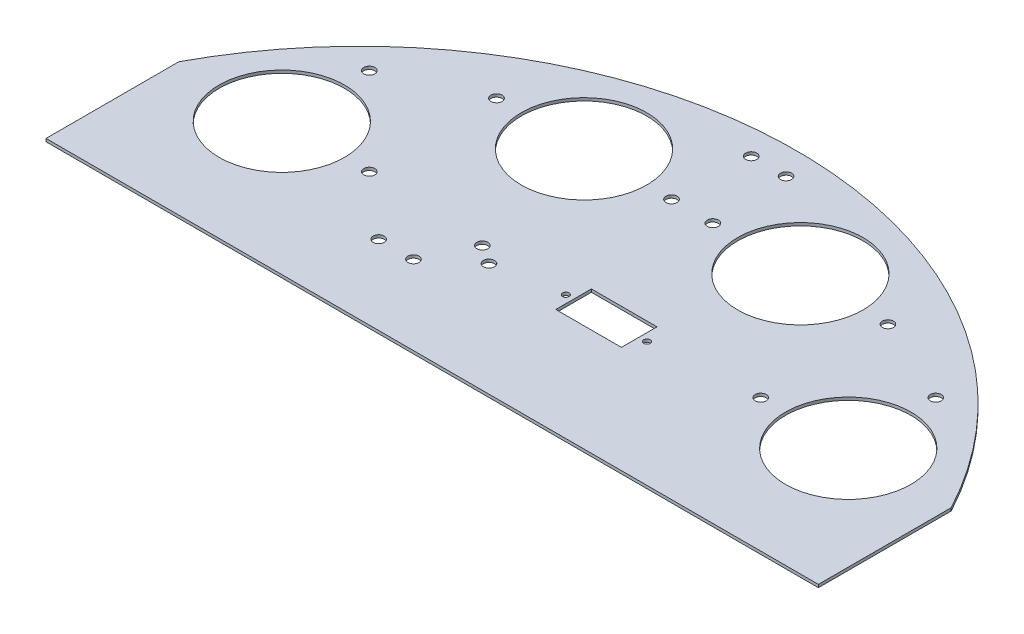
ISO-10303-21;
HEADER;
FILE_DESCRIPTION(('STEP AP214'),'2;1');
FILE_NAME('part.step','',(''),(''),'','','');
FILE_SCHEMA(('AUTOMOTIVE_DESIGN { 1 0 10303 214 1 1 1 1 }'));
ENDSEC;
DATA;
#1=APPLICATION_CONTEXT('core data for automotive mechanical design processes');
#2=APPLICATION_PROTOCOL_DEFINITION('international standard','automotive_design',2000,#1);
#3=PRODUCT_CONTEXT('',#1,'mechanical');
#4=PRODUCT('Part','Part','',(#3));
#5=PRODUCT_RELATED_PRODUCT_CATEGORY('part','',(#4));
#6=PRODUCT_DEFINITION_FORMATION('','',#4);
#7=PRODUCT_DEFINITION_CONTEXT('part definition',#1,'design');
#8=PRODUCT_DEFINITION('design','',#6,#7);
#9=PRODUCT_DEFINITION_SHAPE('','',#8);
#10=(LENGTH_UNIT() NAMED_UNIT(*) SI_UNIT(.MILLI.,.METRE.));
#11=(NAMED_UNIT(*) PLANE_ANGLE_UNIT() SI_UNIT($,.RADIAN.));
#12=(NAMED_UNIT(*) SI_UNIT($,.STERADIAN.) SOLID_ANGLE_UNIT());
#13=UNCERTAINTY_MEASURE_WITH_UNIT(LENGTH_MEASURE(1.E-05),#10,'distance_accuracy_value','');
#14=(GEOMETRIC_REPRESENTATION_CONTEXT(3) GLOBAL_UNCERTAINTY_ASSIGNED_CONTEXT((#13)) GLOBAL_UNIT_ASSIGNED_CONTEXT((#10,
#11,#12)) REPRESENTATION_CONTEXT('',''));
#15=CARTESIAN_POINT('',(0.,0.,0.));
#16=DIRECTION('',(0.,0.,1.));
#17=DIRECTION('',(1.,0.,0.));
#18=AXIS2_PLACEMENT_3D('',#15,#16,#17);
#19=CARTESIAN_POINT('',(0.,0.,0.));
#20=DIRECTION('',(0.,1.,0.));
#21=DIRECTION('',(0.,0.,1.));
#22=AXIS2_PLACEMENT_3D('',#19,#20,#21);
#23=PLANE('',#22);
#24=CARTESIAN_POINT('',(67.237534512333,0.,-26.561617597691));
#25=DIRECTION('',(0.,-1.,0.));
#26=DIRECTION('',(0.,0.,-1.));
#27=AXIS2_PLACEMENT_3D('',#24,#25,#26);
#28=CIRCLE('',#27,1.89865);
#29=CARTESIAN_POINT('',(67.237534512333,0.,-28.460267597691));
#30=VERTEX_POINT('',#29);
#31=EDGE_CURVE('E471',#30,#30,#28,.T.);
#32=ORIENTED_EDGE('',*,*,#31,.F.);
#33=EDGE_LOOP('',(#32));
#34=FACE_BOUND('',#33,.T.);
#35=CARTESIAN_POINT('',(67.2375345123306,0.,-70.1541692780059));
#36=DIRECTION('',(0.,-1.,0.));
#37=DIRECTION('',(0.,0.,-1.));
#38=AXIS2_PLACEMENT_3D('',#35,#36,#37);
#39=CIRCLE('',#38,1.89865);
#40=CARTESIAN_POINT('',(67.2375345123306,0.,-72.0528192780059));
#41=VERTEX_POINT('',#40);
#42=EDGE_CURVE('E479',#41,#41,#39,.T.);
#43=ORIENTED_EDGE('',*,*,#42,.F.);
#44=EDGE_LOOP('',(#43));
#45=FACE_BOUND('',#44,.T.);
#46=CARTESIAN_POINT('',(7.23753451233063,0.,-70.1541692780059));
#47=DIRECTION('',(0.,-1.,0.));
#48=DIRECTION('',(0.,0.,-1.));
#49=AXIS2_PLACEMENT_3D('',#46,#47,#48);
#50=CIRCLE('',#49,1.89865);
#51=CARTESIAN_POINT('',(7.23753451233063,0.,-72.0528192780059));
#52=VERTEX_POINT('',#51);
#53=EDGE_CURVE('E485',#52,#52,#50,.T.);
#54=ORIENTED_EDGE('',*,*,#53,.F.);
#55=EDGE_LOOP('',(#54));
#56=FACE_BOUND('',#55,.T.);
#57=CARTESIAN_POINT('',(-6.92654413765696,0.,-70.1541692780059));
#58=DIRECTION('',(0.,-1.,0.));
#59=DIRECTION('',(0.,0.,-1.));
#60=AXIS2_PLACEMENT_3D('',#57,#58,#59);
#61=CIRCLE('',#60,1.89865);
#62=CARTESIAN_POINT('',(-6.92654413765696,0.,-72.0528192780059));
#63=VERTEX_POINT('',#62);
#64=EDGE_CURVE('E491',#63,#63,#61,.T.);
#65=ORIENTED_EDGE('',*,*,#64,.F.);
#66=EDGE_LOOP('',(#65));
#67=FACE_BOUND('',#66,.T.);
#68=CARTESIAN_POINT('',(-66.926544137657,0.,-70.1541692780059));
#69=DIRECTION('',(0.,-1.,0.));
#70=DIRECTION('',(0.,0.,-1.));
#71=AXIS2_PLACEMENT_3D('',#68,#69,#70);
#72=CIRCLE('',#71,1.89865);
#73=CARTESIAN_POINT('',(-66.926544137657,0.,-72.0528192780059));
#74=VERTEX_POINT('',#73);
#75=EDGE_CURVE('E497',#74,#74,#72,.T.);
#76=ORIENTED_EDGE('',*,*,#75,.F.);
#77=EDGE_LOOP('',(#76));
#78=FACE_BOUND('',#77,.T.);
#79=CARTESIAN_POINT('',(-96.9265441376548,0.,-56.5616175976809));
#80=DIRECTION('',(0.,-1.,0.));
#81=DIRECTION('',(0.,0.,-1.));
#82=AXIS2_PLACEMENT_3D('',#79,#80,#81);
#83=CIRCLE('',#82,1.89865);
#84=CARTESIAN_POINT('',(-96.9265441376548,0.,-58.4602675976809));
#85=VERTEX_POINT('',#84);
#86=EDGE_CURVE('E503',#85,#85,#83,.T.);
#87=ORIENTED_EDGE('',*,*,#86,.F.);
#88=EDGE_LOOP('',(#87));
#89=FACE_BOUND('',#88,.T.);
#90=CARTESIAN_POINT('',(-66.9265441376548,0.,-26.561617597691));
#91=DIRECTION('',(0.,-1.,0.));
#92=DIRECTION('',(0.,0.,-1.));
#93=AXIS2_PLACEMENT_3D('',#90,#91,#92);
#94=CIRCLE('',#93,1.89865);
#95=CARTESIAN_POINT('',(-66.9265441376548,0.,-28.460267597691));
#96=VERTEX_POINT('',#95);
#97=EDGE_CURVE('E509',#96,#96,#94,.T.);
#98=ORIENTED_EDGE('',*,*,#97,.F.);
#99=EDGE_LOOP('',(#98));
#100=FACE_BOUND('',#99,.T.);
#101=CARTESIAN_POINT('',(-19.1543473807719,0.,-19.7948636797243));
#102=DIRECTION('',(0.,-1.,0.));
#103=DIRECTION('',(0.,0.,-1.));
#104=AXIS2_PLACEMENT_3D('',#101,#102,#103);
#105=CIRCLE('',#104,1.89865);
#106=CARTESIAN_POINT('',(-19.1543473807719,0.,-21.6935136797243));
#107=VERTEX_POINT('',#106);
#108=EDGE_CURVE('E515',#107,#107,#105,.T.);
#109=ORIENTED_EDGE('',*,*,#108,.F.);
#110=EDGE_LOOP('',(#109));
#111=FACE_BOUND('',#110,.T.);
#112=CARTESIAN_POINT('',(-45.2913650837094,0.,-8.12316032959307));
#113=DIRECTION('',(0.,-1.,0.));
#114=DIRECTION('',(0.,0.,-1.));
#115=AXIS2_PLACEMENT_3D('',#112,#113,#114);
#116=CIRCLE('',#115,1.89865);
#117=CARTESIAN_POINT('',(-45.2913650837094,0.,-10.0218103295931));
#118=VERTEX_POINT('',#117);
#119=EDGE_CURVE('E521',#118,#118,#116,.T.);
#120=ORIENTED_EDGE('',*,*,#119,.F.);
#121=EDGE_LOOP('',(#120));
#122=FACE_BOUND('',#121,.T.);
#123=CARTESIAN_POINT('',(-33.3613650837094,0.,-8.12316032959307));
#124=DIRECTION('',(0.,-1.,0.));
#125=DIRECTION('',(0.,0.,-1.));
#126=AXIS2_PLACEMENT_3D('',#123,#124,#125);
#127=CIRCLE('',#126,1.89865);
#128=CARTESIAN_POINT('',(-33.3613650837094,0.,-10.0218103295931));
#129=VERTEX_POINT('',#128);
#130=EDGE_CURVE('E527',#129,#129,#127,.T.);
#131=ORIENTED_EDGE('',*,*,#130,.F.);
#132=EDGE_LOOP('',(#131));
#133=FACE_BOUND('',#132,.T.);
#134=CARTESIAN_POINT('',(-6.06113532178358,0.,-96.6113301229937));
#135=DIRECTION('',(0.,-1.,0.));
#136=DIRECTION('',(0.,0.,-1.));
#137=AXIS2_PLACEMENT_3D('',#134,#135,#136);
#138=CIRCLE('',#137,1.89865);
#139=CARTESIAN_POINT('',(-6.06113532178358,0.,-98.5099801229937));
#140=VERTEX_POINT('',#139);
#141=EDGE_CURVE('E533',#140,#140,#138,.T.);
#142=ORIENTED_EDGE('',*,*,#141,.F.);
#143=EDGE_LOOP('',(#142));
#144=FACE_BOUND('',#143,.T.);
#145=CARTESIAN_POINT('',(5.86886720958533,0.,-96.6113301229937));
#146=DIRECTION('',(0.,-1.,0.));
#147=DIRECTION('',(0.,0.,-1.));
#148=AXIS2_PLACEMENT_3D('',#145,#146,#147);
#149=CIRCLE('',#148,1.89865);
#150=CARTESIAN_POINT('',(5.86886720958533,0.,-98.5099801229937));
#151=VERTEX_POINT('',#150);
#152=EDGE_CURVE('E228',#151,#151,#149,.T.);
#153=ORIENTED_EDGE('',*,*,#152,.F.);
#154=EDGE_LOOP('',(#153));
#155=FACE_BOUND('',#154,.T.);
#156=CARTESIAN_POINT('',(3.27642308215973,0.,-23.7231603295504));
#157=DIRECTION('',(0.,-1.,0.));
#158=DIRECTION('',(0.,0.,-1.));
#159=AXIS2_PLACEMENT_3D('',#156,#157,#158);
#160=CIRCLE('',#159,1.10000000000447);
#161=CARTESIAN_POINT('',(3.27642308215973,0.,-24.8231603295549));
#162=VERTEX_POINT('',#161);
#163=EDGE_CURVE('E123',#162,#162,#160,.T.);
#164=ORIENTED_EDGE('',*,*,#163,.F.);
#165=EDGE_LOOP('',(#164));
#166=FACE_BOUND('',#165,.T.);
#167=CARTESIAN_POINT('',(31.0764230821597,0.,-23.7231603295576));
#168=DIRECTION('',(0.,-1.,0.));
#169=DIRECTION('',(0.,0.,-1.));
#170=AXIS2_PLACEMENT_3D('',#167,#168,#169);
#171=CIRCLE('',#170,1.10000000000448);
#172=CARTESIAN_POINT('',(31.0764230821597,0.,-24.823160329562));
#173=VERTEX_POINT('',#172);
#174=EDGE_CURVE('E239',#173,#173,#171,.T.);
#175=ORIENTED_EDGE('',*,*,#174,.F.);
#176=EDGE_LOOP('',(#175));
#177=FACE_BOUND('',#176,.T.);
#178=CARTESIAN_POINT('',(97.237534512333,0.,-26.561617597691));
#179=DIRECTION('',(0.,1.,0.));
#180=DIRECTION('',(0.,0.,1.));
#181=AXIS2_PLACEMENT_3D('',#178,#179,#180);
#182=CIRCLE('',#181,21.5);
#183=CARTESIAN_POINT('',(97.237534512333,0.,-5.06161759769103));
#184=VERTEX_POINT('',#183);
#185=EDGE_CURVE('E143',#184,#184,#182,.T.);
#186=ORIENTED_EDGE('',*,*,#185,.T.);
#187=EDGE_LOOP('',(#186));
#188=FACE_BOUND('',#187,.T.);
#189=CARTESIAN_POINT('',(37.2375345123306,0.,-70.1541692780098));
#190=DIRECTION('',(0.,1.,0.));
#191=DIRECTION('',(0.,0.,1.));
#192=AXIS2_PLACEMENT_3D('',#189,#190,#191);
#193=CIRCLE('',#192,21.5);
#194=CARTESIAN_POINT('',(37.2375345123306,0.,-48.6541692780098));
#195=VERTEX_POINT('',#194);
#196=EDGE_CURVE('E180',#195,#195,#193,.T.);
#197=ORIENTED_EDGE('',*,*,#196,.T.);
#198=EDGE_LOOP('',(#197));
#199=FACE_BOUND('',#198,.T.);
#200=CARTESIAN_POINT('',(-36.926544137657,0.,-70.1541692780059));
#201=DIRECTION('',(0.,1.,0.));
#202=DIRECTION('',(0.,0.,1.));
#203=AXIS2_PLACEMENT_3D('',#200,#201,#202);
#204=CIRCLE('',#203,21.5);
#205=CARTESIAN_POINT('',(-36.926544137657,0.,-48.6541692780059));
#206=VERTEX_POINT('',#205);
#207=EDGE_CURVE('E177',#206,#206,#204,.T.);
#208=ORIENTED_EDGE('',*,*,#207,.T.);
#209=EDGE_LOOP('',(#208));
#210=FACE_BOUND('',#209,.T.);
#211=CARTESIAN_POINT('',(-96.9265441376548,0.,-26.5616175976809));
#212=DIRECTION('',(0.,1.,0.));
#213=DIRECTION('',(0.,0.,1.));
#214=AXIS2_PLACEMENT_3D('',#211,#212,#213);
#215=CIRCLE('',#214,21.5);
#216=CARTESIAN_POINT('',(-96.9265441376548,0.,-5.0616175976809));
#217=VERTEX_POINT('',#216);
#218=EDGE_CURVE('E174',#217,#217,#215,.T.);
#219=ORIENTED_EDGE('',*,*,#218,.T.);
#220=EDGE_LOOP('',(#219));
#221=FACE_BOUND('',#220,.T.);
#222=DIRECTION('',(0.,0.,1.));
#223=VECTOR('',#222,1.);
#224=CARTESIAN_POINT('',(-132.226234516957,0.,0.));
#225=LINE('',#224,#223);
#226=CARTESIAN_POINT('',(-132.226234516957,0.,-26.5616175976809));
#227=VERTEX_POINT('',#226);
#228=CARTESIAN_POINT('',(-132.226234516957,0.,18.9726126774052));
#229=VERTEX_POINT('',#228);
#230=EDGE_CURVE('E136',#227,#229,#225,.T.);
#231=ORIENTED_EDGE('',*,*,#230,.F.);
#232=CARTESIAN_POINT('',(0.155495187338843,0.,43.9726126774052));
#233=DIRECTION('',(0.,1.,0.));
#234=DIRECTION('',(0.,0.,1.));
#235=AXIS2_PLACEMENT_3D('',#232,#233,#234);
#236=CIRCLE('',#235,150.);
#237=CARTESIAN_POINT('',(132.537224891629,0.,-26.561617597691));
#238=VERTEX_POINT('',#237);
#239=EDGE_CURVE('E172',#238,#227,#236,.T.);
#240=ORIENTED_EDGE('',*,*,#239,.F.);
#241=DIRECTION('',(0.,0.,1.));
#242=VECTOR('',#241,1.);
#243=CARTESIAN_POINT('',(132.537224891629,0.,0.));
#244=LINE('',#243,#242);
#245=CARTESIAN_POINT('',(132.537224891629,0.,18.9726126774052));
#246=VERTEX_POINT('',#245);
#247=EDGE_CURVE('E169',#238,#246,#244,.T.);
#248=ORIENTED_EDGE('',*,*,#247,.T.);
#249=DIRECTION('',(-1.,0.,0.));
#250=VECTOR('',#249,1.);
#251=CARTESIAN_POINT('',(0.,0.,18.9726126774052));
#252=LINE('',#251,#250);
#253=EDGE_CURVE('E166',#246,#229,#252,.T.);
#254=ORIENTED_EDGE('',*,*,#253,.T.);
#255=EDGE_LOOP('',(#231,#240,#248,#254));
#256=FACE_BOUND('',#255,.T.);
#257=DIRECTION('',(1.,0.,0.));
#258=VECTOR('',#257,1.);
#259=CARTESIAN_POINT('',(0.,0.,-17.6231603295567));
#260=LINE('',#259,#258);
#261=CARTESIAN_POINT('',(5.92642308216108,0.,-17.6231603295567));
#262=VERTEX_POINT('',#261);
#263=CARTESIAN_POINT('',(28.4264230821584,0.,-17.6231603295567));
#264=VERTEX_POINT('',#263);
#265=EDGE_CURVE('E59',#262,#264,#260,.T.);
#266=ORIENTED_EDGE('',*,*,#265,.T.);
#267=DIRECTION('',(0.,0.,-1.));
#268=VECTOR('',#267,1.);
#269=CARTESIAN_POINT('',(28.4264230821584,0.,0.));
#270=LINE('',#269,#268);
#271=CARTESIAN_POINT('',(28.4264230821584,0.,-29.8231603295513));
#272=VERTEX_POINT('',#271);
#273=EDGE_CURVE('E117',#264,#272,#270,.T.);
#274=ORIENTED_EDGE('',*,*,#273,.T.);
#275=DIRECTION('',(-1.,0.,0.));
#276=VECTOR('',#275,1.);
#277=CARTESIAN_POINT('',(0.,0.,-29.8231603295513));
#278=LINE('',#277,#276);
#279=CARTESIAN_POINT('',(5.92642308216108,0.,-29.8231603295513));
#280=VERTEX_POINT('',#279);
#281=EDGE_CURVE('E120',#272,#280,#278,.T.);
#282=ORIENTED_EDGE('',*,*,#281,.T.);
#283=DIRECTION('',(0.,0.,1.));
#284=VECTOR('',#283,1.);
#285=CARTESIAN_POINT('',(5.92642308216108,0.,0.));
#286=LINE('',#285,#284);
#287=EDGE_CURVE('E129',#280,#262,#286,.T.);
#288=ORIENTED_EDGE('',*,*,#287,.T.);
#289=EDGE_LOOP('',(#266,#274,#282,#288));
#290=FACE_BOUND('',#289,.T.);
#291=CARTESIAN_POINT('',(-25.6482402627617,0.,-24.0247401835058));
#292=DIRECTION('',(0.,-1.,0.));
#293=DIRECTION('',(0.,0.,-1.));
#294=AXIS2_PLACEMENT_3D('',#291,#292,#293);
#295=CIRCLE('',#294,1.89865);
#296=CARTESIAN_POINT('',(-25.6482402627617,0.,-25.9233901835058));
#297=VERTEX_POINT('',#296);
#298=EDGE_CURVE('E227',#297,#297,#295,.T.);
#299=ORIENTED_EDGE('',*,*,#298,.F.);
#300=EDGE_LOOP('',(#299));
#301=FACE_BOUND('',#300,.T.);
#302=CARTESIAN_POINT('',(97.237534512333,0.,-56.561617597691));
#303=DIRECTION('',(0.,-1.,0.));
#304=DIRECTION('',(0.,0.,-1.));
#305=AXIS2_PLACEMENT_3D('',#302,#303,#304);
#306=CIRCLE('',#305,1.89865);
#307=CARTESIAN_POINT('',(97.237534512333,0.,-58.460267597691));
#308=VERTEX_POINT('',#307);
#309=EDGE_CURVE('E468',#308,#308,#306,.T.);
#310=ORIENTED_EDGE('',*,*,#309,.F.);
#311=EDGE_LOOP('',(#310));
#312=FACE_BOUND('',#311,.T.);
#313=ADVANCED_FACE('F36',(#34,#45,#56,#67,#78,#89,#100,#111,#122,#133,#144,#155,#166,#177,#188,
#199,#210,#221,#256,#290,#301,#312),#23,.F.);
#314=CARTESIAN_POINT('',(0.,1.,0.));
#315=DIRECTION('',(0.,1.,0.));
#316=DIRECTION('',(0.,0.,1.));
#317=AXIS2_PLACEMENT_3D('',#314,#315,#316);
#318=PLANE('',#317);
#319=CARTESIAN_POINT('',(97.237534512333,1.,-56.561617597691));
#320=DIRECTION('',(0.,-1.,0.));
#321=DIRECTION('',(0.,0.,-1.));
#322=AXIS2_PLACEMENT_3D('',#319,#320,#321);
#323=CIRCLE('',#322,1.89865);
#324=CARTESIAN_POINT('',(97.237534512333,1.,-58.460267597691));
#325=VERTEX_POINT('',#324);
#326=EDGE_CURVE('E465',#325,#325,#323,.T.);
#327=ORIENTED_EDGE('',*,*,#326,.T.);
#328=EDGE_LOOP('',(#327));
#329=FACE_BOUND('',#328,.T.);
#330=CARTESIAN_POINT('',(67.237534512333,1.,-26.561617597691));
#331=DIRECTION('',(0.,-1.,0.));
#332=DIRECTION('',(0.,0.,-1.));
#333=AXIS2_PLACEMENT_3D('',#330,#331,#332);
#334=CIRCLE('',#333,1.89865);
#335=CARTESIAN_POINT('',(67.237534512333,1.,-28.460267597691));
#336=VERTEX_POINT('',#335);
#337=EDGE_CURVE('E476',#336,#336,#334,.T.);
#338=ORIENTED_EDGE('',*,*,#337,.T.);
#339=EDGE_LOOP('',(#338));
#340=FACE_BOUND('',#339,.T.);
#341=CARTESIAN_POINT('',(67.2375345123306,1.,-70.1541692780059));
#342=DIRECTION('',(0.,-1.,0.));
#343=DIRECTION('',(0.,0.,-1.));
#344=AXIS2_PLACEMENT_3D('',#341,#342,#343);
#345=CIRCLE('',#344,1.89865);
#346=CARTESIAN_POINT('',(67.2375345123306,1.,-72.0528192780059));
#347=VERTEX_POINT('',#346);
#348=EDGE_CURVE('E482',#347,#347,#345,.T.);
#349=ORIENTED_EDGE('',*,*,#348,.T.);
#350=EDGE_LOOP('',(#349));
#351=FACE_BOUND('',#350,.T.);
#352=CARTESIAN_POINT('',(7.23753451233063,1.,-70.1541692780059));
#353=DIRECTION('',(0.,-1.,0.));
#354=DIRECTION('',(0.,0.,-1.));
#355=AXIS2_PLACEMENT_3D('',#352,#353,#354);
#356=CIRCLE('',#355,1.89865);
#357=CARTESIAN_POINT('',(7.23753451233063,1.,-72.0528192780059));
#358=VERTEX_POINT('',#357);
#359=EDGE_CURVE('E488',#358,#358,#356,.T.);
#360=ORIENTED_EDGE('',*,*,#359,.T.);
#361=EDGE_LOOP('',(#360));
#362=FACE_BOUND('',#361,.T.);
#363=CARTESIAN_POINT('',(-6.92654413765696,1.,-70.1541692780059));
#364=DIRECTION('',(0.,-1.,0.));
#365=DIRECTION('',(0.,0.,-1.));
#366=AXIS2_PLACEMENT_3D('',#363,#364,#365);
#367=CIRCLE('',#366,1.89865);
#368=CARTESIAN_POINT('',(-6.92654413765696,1.,-72.0528192780059));
#369=VERTEX_POINT('',#368);
#370=EDGE_CURVE('E494',#369,#369,#367,.T.);
#371=ORIENTED_EDGE('',*,*,#370,.T.);
#372=EDGE_LOOP('',(#371));
#373=FACE_BOUND('',#372,.T.);
#374=CARTESIAN_POINT('',(-66.926544137657,1.,-70.1541692780059));
#375=DIRECTION('',(0.,-1.,0.));
#376=DIRECTION('',(0.,0.,-1.));
#377=AXIS2_PLACEMENT_3D('',#374,#375,#376);
#378=CIRCLE('',#377,1.89865);
#379=CARTESIAN_POINT('',(-66.926544137657,1.,-72.0528192780059));
#380=VERTEX_POINT('',#379);
#381=EDGE_CURVE('E500',#380,#380,#378,.T.);
#382=ORIENTED_EDGE('',*,*,#381,.T.);
#383=EDGE_LOOP('',(#382));
#384=FACE_BOUND('',#383,.T.);
#385=CARTESIAN_POINT('',(-96.9265441376548,1.,-56.5616175976809));
#386=DIRECTION('',(0.,-1.,0.));
#387=DIRECTION('',(0.,0.,-1.));
#388=AXIS2_PLACEMENT_3D('',#385,#386,#387);
#389=CIRCLE('',#388,1.89865);
#390=CARTESIAN_POINT('',(-96.9265441376548,1.,-58.4602675976809));
#391=VERTEX_POINT('',#390);
#392=EDGE_CURVE('E506',#391,#391,#389,.T.);
#393=ORIENTED_EDGE('',*,*,#392,.T.);
#394=EDGE_LOOP('',(#393));
#395=FACE_BOUND('',#394,.T.);
#396=CARTESIAN_POINT('',(-66.9265441376548,1.,-26.561617597691));
#397=DIRECTION('',(0.,-1.,0.));
#398=DIRECTION('',(0.,0.,-1.));
#399=AXIS2_PLACEMENT_3D('',#396,#397,#398);
#400=CIRCLE('',#399,1.89865);
#401=CARTESIAN_POINT('',(-66.9265441376548,1.,-28.460267597691));
#402=VERTEX_POINT('',#401);
#403=EDGE_CURVE('E512',#402,#402,#400,.T.);
#404=ORIENTED_EDGE('',*,*,#403,.T.);
#405=EDGE_LOOP('',(#404));
#406=FACE_BOUND('',#405,.T.);
#407=CARTESIAN_POINT('',(-19.1543473807719,1.,-19.7948636797243));
#408=DIRECTION('',(0.,-1.,0.));
#409=DIRECTION('',(0.,0.,-1.));
#410=AXIS2_PLACEMENT_3D('',#407,#408,#409);
#411=CIRCLE('',#410,1.89865);
#412=CARTESIAN_POINT('',(-19.1543473807719,1.,-21.6935136797243));
#413=VERTEX_POINT('',#412);
#414=EDGE_CURVE('E518',#413,#413,#411,.T.);
#415=ORIENTED_EDGE('',*,*,#414,.T.);
#416=EDGE_LOOP('',(#415));
#417=FACE_BOUND('',#416,.T.);
#418=CARTESIAN_POINT('',(-45.2913650837094,1.,-8.12316032959307));
#419=DIRECTION('',(0.,-1.,0.));
#420=DIRECTION('',(0.,0.,-1.));
#421=AXIS2_PLACEMENT_3D('',#418,#419,#420);
#422=CIRCLE('',#421,1.89865);
#423=CARTESIAN_POINT('',(-45.2913650837094,1.,-10.0218103295931));
#424=VERTEX_POINT('',#423);
#425=EDGE_CURVE('E524',#424,#424,#422,.T.);
#426=ORIENTED_EDGE('',*,*,#425,.T.);
#427=EDGE_LOOP('',(#426));
#428=FACE_BOUND('',#427,.T.);
#429=CARTESIAN_POINT('',(-33.3613650837094,1.,-8.12316032959307));
#430=DIRECTION('',(0.,-1.,0.));
#431=DIRECTION('',(0.,0.,-1.));
#432=AXIS2_PLACEMENT_3D('',#429,#430,#431);
#433=CIRCLE('',#432,1.89865);
#434=CARTESIAN_POINT('',(-33.3613650837094,1.,-10.0218103295931));
#435=VERTEX_POINT('',#434);
#436=EDGE_CURVE('E530',#435,#435,#433,.T.);
#437=ORIENTED_EDGE('',*,*,#436,.T.);
#438=EDGE_LOOP('',(#437));
#439=FACE_BOUND('',#438,.T.);
#440=CARTESIAN_POINT('',(-6.06113532178358,1.,-96.6113301229937));
#441=DIRECTION('',(0.,-1.,0.));
#442=DIRECTION('',(0.,0.,-1.));
#443=AXIS2_PLACEMENT_3D('',#440,#441,#442);
#444=CIRCLE('',#443,1.89865);
#445=CARTESIAN_POINT('',(-6.06113532178358,1.,-98.5099801229937));
#446=VERTEX_POINT('',#445);
#447=EDGE_CURVE('E233',#446,#446,#444,.T.);
#448=ORIENTED_EDGE('',*,*,#447,.T.);
#449=EDGE_LOOP('',(#448));
#450=FACE_BOUND('',#449,.T.);
#451=DIRECTION('',(0.,0.,-1.));
#452=VECTOR('',#451,1.);
#453=CARTESIAN_POINT('',(28.4264230821584,1.,0.));
#454=LINE('',#453,#452);
#455=CARTESIAN_POINT('',(28.4264230821584,1.,-17.6231603295567));
#456=VERTEX_POINT('',#455);
#457=CARTESIAN_POINT('',(28.4264230821584,1.,-29.8231603295513));
#458=VERTEX_POINT('',#457);
#459=EDGE_CURVE('E112',#456,#458,#454,.T.);
#460=ORIENTED_EDGE('',*,*,#459,.F.);
#461=DIRECTION('',(1.,0.,0.));
#462=VECTOR('',#461,1.);
#463=CARTESIAN_POINT('',(0.,1.,-17.6231603295567));
#464=LINE('',#463,#462);
#465=CARTESIAN_POINT('',(5.92642308216108,1.,-17.6231603295567));
#466=VERTEX_POINT('',#465);
#467=EDGE_CURVE('E108',#466,#456,#464,.T.);
#468=ORIENTED_EDGE('',*,*,#467,.F.);
#469=DIRECTION('',(0.,0.,1.));
#470=VECTOR('',#469,1.);
#471=CARTESIAN_POINT('',(5.92642308216108,1.,0.));
#472=LINE('',#471,#470);
#473=CARTESIAN_POINT('',(5.92642308216108,1.,-29.8231603295513));
#474=VERTEX_POINT('',#473);
#475=EDGE_CURVE('E100',#474,#466,#472,.T.);
#476=ORIENTED_EDGE('',*,*,#475,.F.);
#477=DIRECTION('',(-1.,0.,0.));
#478=VECTOR('',#477,1.);
#479=CARTESIAN_POINT('',(0.,1.,-29.8231603295513));
#480=LINE('',#479,#478);
#481=EDGE_CURVE('E107',#458,#474,#480,.T.);
#482=ORIENTED_EDGE('',*,*,#481,.F.);
#483=EDGE_LOOP('',(#460,#468,#476,#482));
#484=FACE_BOUND('',#483,.T.);
#485=CARTESIAN_POINT('',(97.237534512333,1.,-26.561617597691));
#486=DIRECTION('',(0.,1.,0.));
#487=DIRECTION('',(0.,0.,1.));
#488=AXIS2_PLACEMENT_3D('',#485,#486,#487);
#489=CIRCLE('',#488,21.5);
#490=CARTESIAN_POINT('',(97.237534512333,1.,-5.06161759769103));
#491=VERTEX_POINT('',#490);
#492=EDGE_CURVE('E160',#491,#491,#489,.T.);
#493=ORIENTED_EDGE('',*,*,#492,.F.);
#494=EDGE_LOOP('',(#493));
#495=FACE_BOUND('',#494,.T.);
#496=CARTESIAN_POINT('',(37.2375345123306,1.,-70.1541692780098));
#497=DIRECTION('',(0.,1.,0.));
#498=DIRECTION('',(0.,0.,1.));
#499=AXIS2_PLACEMENT_3D('',#496,#497,#498);
#500=CIRCLE('',#499,21.5);
#501=CARTESIAN_POINT('',(37.2375345123306,1.,-48.6541692780098));
#502=VERTEX_POINT('',#501);
#503=EDGE_CURVE('E157',#502,#502,#500,.T.);
#504=ORIENTED_EDGE('',*,*,#503,.F.);
#505=EDGE_LOOP('',(#504));
#506=FACE_BOUND('',#505,.T.);
#507=CARTESIAN_POINT('',(-36.926544137657,1.,-70.1541692780059));
#508=DIRECTION('',(0.,1.,0.));
#509=DIRECTION('',(0.,0.,1.));
#510=AXIS2_PLACEMENT_3D('',#507,#508,#509);
#511=CIRCLE('',#510,21.5);
#512=CARTESIAN_POINT('',(-36.926544137657,1.,-48.6541692780059));
#513=VERTEX_POINT('',#512);
#514=EDGE_CURVE('E154',#513,#513,#511,.T.);
#515=ORIENTED_EDGE('',*,*,#514,.F.);
#516=EDGE_LOOP('',(#515));
#517=FACE_BOUND('',#516,.T.);
#518=CARTESIAN_POINT('',(-96.9265441376548,1.,-26.5616175976809));
#519=DIRECTION('',(0.,1.,0.));
#520=DIRECTION('',(0.,0.,1.));
#521=AXIS2_PLACEMENT_3D('',#518,#519,#520);
#522=CIRCLE('',#521,21.5);
#523=CARTESIAN_POINT('',(-96.9265441376548,1.,-5.0616175976809));
#524=VERTEX_POINT('',#523);
#525=EDGE_CURVE('E151',#524,#524,#522,.T.);
#526=ORIENTED_EDGE('',*,*,#525,.F.);
#527=EDGE_LOOP('',(#526));
#528=FACE_BOUND('',#527,.T.);
#529=DIRECTION('',(0.,0.,1.));
#530=VECTOR('',#529,1.);
#531=CARTESIAN_POINT('',(-132.226234516957,1.,0.));
#532=LINE('',#531,#530);
#533=CARTESIAN_POINT('',(-132.226234516957,1.,-26.5616175976809));
#534=VERTEX_POINT('',#533);
#535=CARTESIAN_POINT('',(-132.226234516957,1.,18.9726126774052));
#536=VERTEX_POINT('',#535);
#537=EDGE_CURVE('E140',#534,#536,#532,.T.);
#538=ORIENTED_EDGE('',*,*,#537,.T.);
#539=DIRECTION('',(-1.,0.,0.));
#540=VECTOR('',#539,1.);
#541=CARTESIAN_POINT('',(0.,1.,18.9726126774052));
#542=LINE('',#541,#540);
#543=CARTESIAN_POINT('',(132.537224891629,1.,18.9726126774052));
#544=VERTEX_POINT('',#543);
#545=EDGE_CURVE('E142',#544,#536,#542,.T.);
#546=ORIENTED_EDGE('',*,*,#545,.F.);
#547=DIRECTION('',(0.,0.,1.));
#548=VECTOR('',#547,1.);
#549=CARTESIAN_POINT('',(132.537224891629,1.,0.));
#550=LINE('',#549,#548);
#551=CARTESIAN_POINT('',(132.537224891629,1.,-26.561617597691));
#552=VERTEX_POINT('',#551);
#553=EDGE_CURVE('E146',#552,#544,#550,.T.);
#554=ORIENTED_EDGE('',*,*,#553,.F.);
#555=CARTESIAN_POINT('',(0.155495187338843,1.,43.9726126774052));
#556=DIRECTION('',(0.,1.,0.));
#557=DIRECTION('',(0.,0.,1.));
#558=AXIS2_PLACEMENT_3D('',#555,#556,#557);
#559=CIRCLE('',#558,150.);
#560=EDGE_CURVE('E149',#552,#534,#559,.T.);
#561=ORIENTED_EDGE('',*,*,#560,.T.);
#562=EDGE_LOOP('',(#538,#546,#554,#561));
#563=FACE_BOUND('',#562,.T.);
#564=CARTESIAN_POINT('',(31.0764230821597,1.,-23.7231603295576));
#565=DIRECTION('',(0.,-1.,0.));
#566=DIRECTION('',(0.,0.,-1.));
#567=AXIS2_PLACEMENT_3D('',#564,#565,#566);
#568=CIRCLE('',#567,1.10000000000448);
#569=CARTESIAN_POINT('',(31.0764230821597,1.,-24.823160329562));
#570=VERTEX_POINT('',#569);
#571=EDGE_CURVE('E130',#570,#570,#568,.T.);
#572=ORIENTED_EDGE('',*,*,#571,.T.);
#573=EDGE_LOOP('',(#572));
#574=FACE_BOUND('',#573,.T.);
#575=CARTESIAN_POINT('',(3.27642308215973,1.,-23.7231603295504));
#576=DIRECTION('',(0.,-1.,0.));
#577=DIRECTION('',(0.,0.,-1.));
#578=AXIS2_PLACEMENT_3D('',#575,#576,#577);
#579=CIRCLE('',#578,1.10000000000447);
#580=CARTESIAN_POINT('',(3.27642308215973,1.,-24.8231603295549));
#581=VERTEX_POINT('',#580);
#582=EDGE_CURVE('E218',#581,#581,#579,.T.);
#583=ORIENTED_EDGE('',*,*,#582,.T.);
#584=EDGE_LOOP('',(#583));
#585=FACE_BOUND('',#584,.T.);
#586=CARTESIAN_POINT('',(-25.6482402627617,1.,-24.0247401835058));
#587=DIRECTION('',(0.,-1.,0.));
#588=DIRECTION('',(0.,0.,-1.));
#589=AXIS2_PLACEMENT_3D('',#586,#587,#588);
#590=CIRCLE('',#589,1.89865);
#591=CARTESIAN_POINT('',(-25.6482402627617,1.,-25.9233901835058));
#592=VERTEX_POINT('',#591);
#593=EDGE_CURVE('E222',#592,#592,#590,.T.);
#594=ORIENTED_EDGE('',*,*,#593,.T.);
#595=EDGE_LOOP('',(#594));
#596=FACE_BOUND('',#595,.T.);
#597=CARTESIAN_POINT('',(5.86886720958533,1.,-96.6113301229937));
#598=DIRECTION('',(0.,-1.,0.));
#599=DIRECTION('',(0.,0.,-1.));
#600=AXIS2_PLACEMENT_3D('',#597,#598,#599);
#601=CIRCLE('',#600,1.89865);
#602=CARTESIAN_POINT('',(5.86886720958533,1.,-98.5099801229937));
#603=VERTEX_POINT('',#602);
#604=EDGE_CURVE('E225',#603,#603,#601,.T.);
#605=ORIENTED_EDGE('',*,*,#604,.T.);
#606=EDGE_LOOP('',(#605));
#607=FACE_BOUND('',#606,.T.);
#608=ADVANCED_FACE('F115',(#329,#340,#351,#362,#373,#384,#395,#406,#417,#428,#439,#450,#484,
#495,#506,#517,#528,#563,#574,#585,#596,#607),#318,.T.);
#609=CARTESIAN_POINT('',(-132.226234516957,1.,0.));
#610=DIRECTION('',(1.,0.,0.));
#611=DIRECTION('',(0.,0.,-1.));
#612=AXIS2_PLACEMENT_3D('',#609,#610,#611);
#613=PLANE('',#612);
#614=ORIENTED_EDGE('',*,*,#230,.T.);
#615=DIRECTION('',(0.,-1.,0.));
#616=VECTOR('',#615,1.);
#617=CARTESIAN_POINT('',(-132.226234516957,1.,18.9726126774052));
#618=LINE('',#617,#616);
#619=EDGE_CURVE('E11',#536,#229,#618,.T.);
#620=ORIENTED_EDGE('',*,*,#619,.F.);
#621=ORIENTED_EDGE('',*,*,#537,.F.);
#622=DIRECTION('',(0.,-1.,0.));
#623=VECTOR('',#622,1.);
#624=CARTESIAN_POINT('',(-132.226234516957,1.,-26.5616175976809));
#625=LINE('',#624,#623);
#626=EDGE_CURVE('E163',#534,#227,#625,.T.);
#627=ORIENTED_EDGE('',*,*,#626,.T.);
#628=EDGE_LOOP('',(#614,#620,#621,#627));
#629=FACE_BOUND('',#628,.T.);
#630=ADVANCED_FACE('F38',(#629),#613,.F.);
#631=CARTESIAN_POINT('',(0.,1.,18.9726126774052));
#632=DIRECTION('',(0.,0.,1.));
#633=DIRECTION('',(1.,0.,0.));
#634=AXIS2_PLACEMENT_3D('',#631,#632,#633);
#635=PLANE('',#634);
#636=ORIENTED_EDGE('',*,*,#253,.F.);
#637=DIRECTION('',(0.,-1.,0.));
#638=VECTOR('',#637,1.);
#639=CARTESIAN_POINT('',(132.537224891629,1.,18.9726126774052));
#640=LINE('',#639,#638);
#641=EDGE_CURVE('E44',#544,#246,#640,.T.);
#642=ORIENTED_EDGE('',*,*,#641,.F.);
#643=ORIENTED_EDGE('',*,*,#545,.T.);
#644=ORIENTED_EDGE('',*,*,#619,.T.);
#645=EDGE_LOOP('',(#636,#642,#643,#644));
#646=FACE_BOUND('',#645,.T.);
#647=ADVANCED_FACE('F195',(#646),#635,.T.);
#648=CARTESIAN_POINT('',(132.537224891629,1.,0.));
#649=DIRECTION('',(1.,0.,0.));
#650=DIRECTION('',(0.,0.,-1.));
#651=AXIS2_PLACEMENT_3D('',#648,#649,#650);
#652=PLANE('',#651);
#653=ORIENTED_EDGE('',*,*,#247,.F.);
#654=DIRECTION('',(0.,-1.,0.));
#655=VECTOR('',#654,1.);
#656=CARTESIAN_POINT('',(132.537224891629,1.,-26.561617597691));
#657=LINE('',#656,#655);
#658=EDGE_CURVE('E187',#552,#238,#657,.T.);
#659=ORIENTED_EDGE('',*,*,#658,.F.);
#660=ORIENTED_EDGE('',*,*,#553,.T.);
#661=ORIENTED_EDGE('',*,*,#641,.T.);
#662=EDGE_LOOP('',(#653,#659,#660,#661));
#663=FACE_BOUND('',#662,.T.);
#664=ADVANCED_FACE('F191',(#663),#652,.T.);
#665=CARTESIAN_POINT('',(37.2375345123306,1.,-70.1541692780098));
#666=DIRECTION('',(0.,-1.,0.));
#667=DIRECTION('',(0.,0.,-1.));
#668=AXIS2_PLACEMENT_3D('',#665,#666,#667);
#669=CYLINDRICAL_SURFACE('',#668,21.5);
#670=ORIENTED_EDGE('',*,*,#503,.T.);
#671=EDGE_LOOP('',(#670));
#672=FACE_BOUND('',#671,.T.);
#673=ORIENTED_EDGE('',*,*,#196,.F.);
#674=EDGE_LOOP('',(#673));
#675=FACE_BOUND('',#674,.T.);
#676=ADVANCED_FACE('F271',(#672,#675),#669,.F.);
#677=CARTESIAN_POINT('',(-36.926544137657,1.,-70.1541692780059));
#678=DIRECTION('',(0.,-1.,0.));
#679=DIRECTION('',(0.,0.,-1.));
#680=AXIS2_PLACEMENT_3D('',#677,#678,#679);
#681=CYLINDRICAL_SURFACE('',#680,21.5);
#682=ORIENTED_EDGE('',*,*,#514,.T.);
#683=EDGE_LOOP('',(#682));
#684=FACE_BOUND('',#683,.T.);
#685=ORIENTED_EDGE('',*,*,#207,.F.);
#686=EDGE_LOOP('',(#685));
#687=FACE_BOUND('',#686,.T.);
#688=ADVANCED_FACE('F262',(#684,#687),#681,.F.);
#689=CARTESIAN_POINT('',(-96.9265441376548,1.,-26.5616175976809));
#690=DIRECTION('',(0.,-1.,0.));
#691=DIRECTION('',(0.,0.,-1.));
#692=AXIS2_PLACEMENT_3D('',#689,#690,#691);
#693=CYLINDRICAL_SURFACE('',#692,21.5);
#694=ORIENTED_EDGE('',*,*,#525,.T.);
#695=EDGE_LOOP('',(#694));
#696=FACE_BOUND('',#695,.T.);
#697=ORIENTED_EDGE('',*,*,#218,.F.);
#698=EDGE_LOOP('',(#697));
#699=FACE_BOUND('',#698,.T.);
#700=ADVANCED_FACE('F260',(#696,#699),#693,.F.);
#701=CARTESIAN_POINT('',(0.155495187338843,1.,43.9726126774052));
#702=DIRECTION('',(0.,-1.,0.));
#703=DIRECTION('',(0.,0.,-1.));
#704=AXIS2_PLACEMENT_3D('',#701,#702,#703);
#705=CYLINDRICAL_SURFACE('',#704,150.);
#706=ORIENTED_EDGE('',*,*,#239,.T.);
#707=ORIENTED_EDGE('',*,*,#626,.F.);
#708=ORIENTED_EDGE('',*,*,#560,.F.);
#709=ORIENTED_EDGE('',*,*,#658,.T.);
#710=EDGE_LOOP('',(#706,#707,#708,#709));
#711=FACE_BOUND('',#710,.T.);
#712=ADVANCED_FACE('F203',(#711),#705,.T.);
#713=CARTESIAN_POINT('',(97.237534512333,1.,-26.561617597691));
#714=DIRECTION('',(0.,-1.,0.));
#715=DIRECTION('',(0.,0.,-1.));
#716=AXIS2_PLACEMENT_3D('',#713,#714,#715);
#717=CYLINDRICAL_SURFACE('',#716,21.5);
#718=ORIENTED_EDGE('',*,*,#492,.T.);
#719=EDGE_LOOP('',(#718));
#720=FACE_BOUND('',#719,.T.);
#721=ORIENTED_EDGE('',*,*,#185,.F.);
#722=EDGE_LOOP('',(#721));
#723=FACE_BOUND('',#722,.T.);
#724=ADVANCED_FACE('F269',(#720,#723),#717,.F.);
#725=CARTESIAN_POINT('',(0.,1.,-17.6231603295567));
#726=DIRECTION('',(0.,0.,-1.));
#727=DIRECTION('',(-1.,0.,0.));
#728=AXIS2_PLACEMENT_3D('',#725,#726,#727);
#729=PLANE('',#728);
#730=ORIENTED_EDGE('',*,*,#265,.F.);
#731=DIRECTION('',(0.,-1.,0.));
#732=VECTOR('',#731,1.);
#733=CARTESIAN_POINT('',(5.92642308216108,1.,-17.6231603295567));
#734=LINE('',#733,#732);
#735=EDGE_CURVE('E102',#466,#262,#734,.T.);
#736=ORIENTED_EDGE('',*,*,#735,.F.);
#737=ORIENTED_EDGE('',*,*,#467,.T.);
#738=DIRECTION('',(0.,-1.,0.));
#739=VECTOR('',#738,1.);
#740=CARTESIAN_POINT('',(28.4264230821584,1.,-17.6231603295567));
#741=LINE('',#740,#739);
#742=EDGE_CURVE('E134',#456,#264,#741,.T.);
#743=ORIENTED_EDGE('',*,*,#742,.T.);
#744=EDGE_LOOP('',(#730,#736,#737,#743));
#745=FACE_BOUND('',#744,.T.);
#746=ADVANCED_FACE('F110',(#745),#729,.T.);
#747=CARTESIAN_POINT('',(28.4264230821584,1.,0.));
#748=DIRECTION('',(-1.,0.,0.));
#749=DIRECTION('',(0.,0.,1.));
#750=AXIS2_PLACEMENT_3D('',#747,#748,#749);
#751=PLANE('',#750);
#752=ORIENTED_EDGE('',*,*,#273,.F.);
#753=ORIENTED_EDGE('',*,*,#742,.F.);
#754=ORIENTED_EDGE('',*,*,#459,.T.);
#755=DIRECTION('',(0.,-1.,0.));
#756=VECTOR('',#755,1.);
#757=CARTESIAN_POINT('',(28.4264230821584,1.,-29.8231603295513));
#758=LINE('',#757,#756);
#759=EDGE_CURVE('E137',#458,#272,#758,.T.);
#760=ORIENTED_EDGE('',*,*,#759,.T.);
#761=EDGE_LOOP('',(#752,#753,#754,#760));
#762=FACE_BOUND('',#761,.T.);
#763=ADVANCED_FACE('F332',(#762),#751,.T.);
#764=CARTESIAN_POINT('',(0.,1.,-29.8231603295513));
#765=DIRECTION('',(0.,0.,1.));
#766=DIRECTION('',(1.,0.,0.));
#767=AXIS2_PLACEMENT_3D('',#764,#765,#766);
#768=PLANE('',#767);
#769=ORIENTED_EDGE('',*,*,#281,.F.);
#770=ORIENTED_EDGE('',*,*,#759,.F.);
#771=ORIENTED_EDGE('',*,*,#481,.T.);
#772=DIRECTION('',(0.,-1.,0.));
#773=VECTOR('',#772,1.);
#774=CARTESIAN_POINT('',(5.92642308216108,1.,-29.8231603295513));
#775=LINE('',#774,#773);
#776=EDGE_CURVE('E51',#474,#280,#775,.T.);
#777=ORIENTED_EDGE('',*,*,#776,.T.);
#778=EDGE_LOOP('',(#769,#770,#771,#777));
#779=FACE_BOUND('',#778,.T.);
#780=ADVANCED_FACE('F323',(#779),#768,.T.);
#781=CARTESIAN_POINT('',(5.92642308216108,1.,0.));
#782=DIRECTION('',(1.,0.,0.));
#783=DIRECTION('',(0.,0.,-1.));
#784=AXIS2_PLACEMENT_3D('',#781,#782,#783);
#785=PLANE('',#784);
#786=ORIENTED_EDGE('',*,*,#287,.F.);
#787=ORIENTED_EDGE('',*,*,#776,.F.);
#788=ORIENTED_EDGE('',*,*,#475,.T.);
#789=ORIENTED_EDGE('',*,*,#735,.T.);
#790=EDGE_LOOP('',(#786,#787,#788,#789));
#791=FACE_BOUND('',#790,.T.);
#792=ADVANCED_FACE('F101',(#791),#785,.T.);
#793=CARTESIAN_POINT('',(31.0764230821597,1.,-23.7231603295576));
#794=DIRECTION('',(0.,-1.,0.));
#795=DIRECTION('',(0.,0.,-1.));
#796=AXIS2_PLACEMENT_3D('',#793,#794,#795);
#797=CYLINDRICAL_SURFACE('',#796,1.10000000000448);
#798=ORIENTED_EDGE('',*,*,#571,.F.);
#799=EDGE_LOOP('',(#798));
#800=FACE_BOUND('',#799,.T.);
#801=ORIENTED_EDGE('',*,*,#174,.T.);
#802=EDGE_LOOP('',(#801));
#803=FACE_BOUND('',#802,.T.);
#804=ADVANCED_FACE('F303',(#800,#803),#797,.F.);
#805=CARTESIAN_POINT('',(3.27642308215973,1.,-23.7231603295504));
#806=DIRECTION('',(0.,-1.,0.));
#807=DIRECTION('',(0.,0.,-1.));
#808=AXIS2_PLACEMENT_3D('',#805,#806,#807);
#809=CYLINDRICAL_SURFACE('',#808,1.10000000000447);
#810=ORIENTED_EDGE('',*,*,#582,.F.);
#811=EDGE_LOOP('',(#810));
#812=FACE_BOUND('',#811,.T.);
#813=ORIENTED_EDGE('',*,*,#163,.T.);
#814=EDGE_LOOP('',(#813));
#815=FACE_BOUND('',#814,.T.);
#816=ADVANCED_FACE('F244',(#812,#815),#809,.F.);
#817=CARTESIAN_POINT('',(-25.6482402627617,0.,-24.0247401835058));
#818=DIRECTION('',(0.,-1.,0.));
#819=DIRECTION('',(0.,0.,-1.));
#820=AXIS2_PLACEMENT_3D('',#817,#818,#819);
#821=CYLINDRICAL_SURFACE('',#820,1.89865);
#822=ORIENTED_EDGE('',*,*,#593,.F.);
#823=EDGE_LOOP('',(#822));
#824=FACE_BOUND('',#823,.T.);
#825=ORIENTED_EDGE('',*,*,#298,.T.);
#826=EDGE_LOOP('',(#825));
#827=FACE_BOUND('',#826,.T.);
#828=ADVANCED_FACE('F302',(#824,#827),#821,.F.);
#829=CARTESIAN_POINT('',(5.86886720958533,0.,-96.6113301229937));
#830=DIRECTION('',(0.,-1.,0.));
#831=DIRECTION('',(0.,0.,-1.));
#832=AXIS2_PLACEMENT_3D('',#829,#830,#831);
#833=CYLINDRICAL_SURFACE('',#832,1.89865);
#834=ORIENTED_EDGE('',*,*,#604,.F.);
#835=EDGE_LOOP('',(#834));
#836=FACE_BOUND('',#835,.T.);
#837=ORIENTED_EDGE('',*,*,#152,.T.);
#838=EDGE_LOOP('',(#837));
#839=FACE_BOUND('',#838,.T.);
#840=ADVANCED_FACE('F409',(#836,#839),#833,.F.);
#841=CARTESIAN_POINT('',(-6.06113532178358,0.,-96.6113301229937));
#842=DIRECTION('',(0.,-1.,0.));
#843=DIRECTION('',(0.,0.,-1.));
#844=AXIS2_PLACEMENT_3D('',#841,#842,#843);
#845=CYLINDRICAL_SURFACE('',#844,1.89865);
#846=ORIENTED_EDGE('',*,*,#447,.F.);
#847=EDGE_LOOP('',(#846));
#848=FACE_BOUND('',#847,.T.);
#849=ORIENTED_EDGE('',*,*,#141,.T.);
#850=EDGE_LOOP('',(#849));
#851=FACE_BOUND('',#850,.T.);
#852=ADVANCED_FACE('F413',(#848,#851),#845,.F.);
#853=CARTESIAN_POINT('',(-33.3613650837094,0.,-8.12316032959307));
#854=DIRECTION('',(0.,-1.,0.));
#855=DIRECTION('',(0.,0.,-1.));
#856=AXIS2_PLACEMENT_3D('',#853,#854,#855);
#857=CYLINDRICAL_SURFACE('',#856,1.89865);
#858=ORIENTED_EDGE('',*,*,#436,.F.);
#859=EDGE_LOOP('',(#858));
#860=FACE_BOUND('',#859,.T.);
#861=ORIENTED_EDGE('',*,*,#130,.T.);
#862=EDGE_LOOP('',(#861));
#863=FACE_BOUND('',#862,.T.);
#864=ADVANCED_FACE('F416',(#860,#863),#857,.F.);
#865=CARTESIAN_POINT('',(-45.2913650837094,0.,-8.12316032959307));
#866=DIRECTION('',(0.,-1.,0.));
#867=DIRECTION('',(0.,0.,-1.));
#868=AXIS2_PLACEMENT_3D('',#865,#866,#867);
#869=CYLINDRICAL_SURFACE('',#868,1.89865);
#870=ORIENTED_EDGE('',*,*,#425,.F.);
#871=EDGE_LOOP('',(#870));
#872=FACE_BOUND('',#871,.T.);
#873=ORIENTED_EDGE('',*,*,#119,.T.);
#874=EDGE_LOOP('',(#873));
#875=FACE_BOUND('',#874,.T.);
#876=ADVANCED_FACE('F420',(#872,#875),#869,.F.);
#877=CARTESIAN_POINT('',(-19.1543473807719,0.,-19.7948636797243));
#878=DIRECTION('',(0.,-1.,0.));
#879=DIRECTION('',(0.,0.,-1.));
#880=AXIS2_PLACEMENT_3D('',#877,#878,#879);
#881=CYLINDRICAL_SURFACE('',#880,1.89865);
#882=ORIENTED_EDGE('',*,*,#414,.F.);
#883=EDGE_LOOP('',(#882));
#884=FACE_BOUND('',#883,.T.);
#885=ORIENTED_EDGE('',*,*,#108,.T.);
#886=EDGE_LOOP('',(#885));
#887=FACE_BOUND('',#886,.T.);
#888=ADVANCED_FACE('F424',(#884,#887),#881,.F.);
#889=CARTESIAN_POINT('',(-66.9265441376548,0.,-26.561617597691));
#890=DIRECTION('',(0.,-1.,0.));
#891=DIRECTION('',(0.,0.,-1.));
#892=AXIS2_PLACEMENT_3D('',#889,#890,#891);
#893=CYLINDRICAL_SURFACE('',#892,1.89865);
#894=ORIENTED_EDGE('',*,*,#403,.F.);
#895=EDGE_LOOP('',(#894));
#896=FACE_BOUND('',#895,.T.);
#897=ORIENTED_EDGE('',*,*,#97,.T.);
#898=EDGE_LOOP('',(#897));
#899=FACE_BOUND('',#898,.T.);
#900=ADVANCED_FACE('F428',(#896,#899),#893,.F.);
#901=CARTESIAN_POINT('',(-96.9265441376548,0.,-56.5616175976809));
#902=DIRECTION('',(0.,-1.,0.));
#903=DIRECTION('',(0.,0.,-1.));
#904=AXIS2_PLACEMENT_3D('',#901,#902,#903);
#905=CYLINDRICAL_SURFACE('',#904,1.89865);
#906=ORIENTED_EDGE('',*,*,#392,.F.);
#907=EDGE_LOOP('',(#906));
#908=FACE_BOUND('',#907,.T.);
#909=ORIENTED_EDGE('',*,*,#86,.T.);
#910=EDGE_LOOP('',(#909));
#911=FACE_BOUND('',#910,.T.);
#912=ADVANCED_FACE('F432',(#908,#911),#905,.F.);
#913=CARTESIAN_POINT('',(-66.926544137657,0.,-70.1541692780059));
#914=DIRECTION('',(0.,-1.,0.));
#915=DIRECTION('',(0.,0.,-1.));
#916=AXIS2_PLACEMENT_3D('',#913,#914,#915);
#917=CYLINDRICAL_SURFACE('',#916,1.89865);
#918=ORIENTED_EDGE('',*,*,#381,.F.);
#919=EDGE_LOOP('',(#918));
#920=FACE_BOUND('',#919,.T.);
#921=ORIENTED_EDGE('',*,*,#75,.T.);
#922=EDGE_LOOP('',(#921));
#923=FACE_BOUND('',#922,.T.);
#924=ADVANCED_FACE('F436',(#920,#923),#917,.F.);
#925=CARTESIAN_POINT('',(-6.92654413765696,0.,-70.1541692780059));
#926=DIRECTION('',(0.,-1.,0.));
#927=DIRECTION('',(0.,0.,-1.));
#928=AXIS2_PLACEMENT_3D('',#925,#926,#927);
#929=CYLINDRICAL_SURFACE('',#928,1.89865);
#930=ORIENTED_EDGE('',*,*,#370,.F.);
#931=EDGE_LOOP('',(#930));
#932=FACE_BOUND('',#931,.T.);
#933=ORIENTED_EDGE('',*,*,#64,.T.);
#934=EDGE_LOOP('',(#933));
#935=FACE_BOUND('',#934,.T.);
#936=ADVANCED_FACE('F440',(#932,#935),#929,.F.);
#937=CARTESIAN_POINT('',(7.23753451233063,0.,-70.1541692780059));
#938=DIRECTION('',(0.,-1.,0.));
#939=DIRECTION('',(0.,0.,-1.));
#940=AXIS2_PLACEMENT_3D('',#937,#938,#939);
#941=CYLINDRICAL_SURFACE('',#940,1.89865);
#942=ORIENTED_EDGE('',*,*,#359,.F.);
#943=EDGE_LOOP('',(#942));
#944=FACE_BOUND('',#943,.T.);
#945=ORIENTED_EDGE('',*,*,#53,.T.);
#946=EDGE_LOOP('',(#945));
#947=FACE_BOUND('',#946,.T.);
#948=ADVANCED_FACE('F444',(#944,#947),#941,.F.);
#949=CARTESIAN_POINT('',(67.2375345123306,0.,-70.1541692780059));
#950=DIRECTION('',(0.,-1.,0.));
#951=DIRECTION('',(0.,0.,-1.));
#952=AXIS2_PLACEMENT_3D('',#949,#950,#951);
#953=CYLINDRICAL_SURFACE('',#952,1.89865);
#954=ORIENTED_EDGE('',*,*,#348,.F.);
#955=EDGE_LOOP('',(#954));
#956=FACE_BOUND('',#955,.T.);
#957=ORIENTED_EDGE('',*,*,#42,.T.);
#958=EDGE_LOOP('',(#957));
#959=FACE_BOUND('',#958,.T.);
#960=ADVANCED_FACE('F448',(#956,#959),#953,.F.);
#961=CARTESIAN_POINT('',(67.237534512333,0.,-26.561617597691));
#962=DIRECTION('',(0.,-1.,0.));
#963=DIRECTION('',(0.,0.,-1.));
#964=AXIS2_PLACEMENT_3D('',#961,#962,#963);
#965=CYLINDRICAL_SURFACE('',#964,1.89865);
#966=ORIENTED_EDGE('',*,*,#337,.F.);
#967=EDGE_LOOP('',(#966));
#968=FACE_BOUND('',#967,.T.);
#969=ORIENTED_EDGE('',*,*,#31,.T.);
#970=EDGE_LOOP('',(#969));
#971=FACE_BOUND('',#970,.T.);
#972=ADVANCED_FACE('F452',(#968,#971),#965,.F.);
#973=CARTESIAN_POINT('',(97.237534512333,0.,-56.561617597691));
#974=DIRECTION('',(0.,-1.,0.));
#975=DIRECTION('',(0.,0.,-1.));
#976=AXIS2_PLACEMENT_3D('',#973,#974,#975);
#977=CYLINDRICAL_SURFACE('',#976,1.89865);
#978=ORIENTED_EDGE('',*,*,#326,.F.);
#979=EDGE_LOOP('',(#978));
#980=FACE_BOUND('',#979,.T.);
#981=ORIENTED_EDGE('',*,*,#309,.T.);
#982=EDGE_LOOP('',(#981));
#983=FACE_BOUND('',#982,.T.);
#984=ADVANCED_FACE('F456',(#980,#983),#977,.F.);
#985=CLOSED_SHELL('',(#313,#608,#630,#647,#664,#676,#688,#700,#712,#724,#746,#763,#780,#792,
#804,#816,#828,#840,#852,#864,#876,#888,#900,#912,#924,#936,#948,#960,#972,#984));
#986=MANIFOLD_SOLID_BREP('B2',#985);
#987=ADVANCED_BREP_SHAPE_REPRESENTATION('',(#18,#986),#14);
#988=SHAPE_DEFINITION_REPRESENTATION(#9,#987);
ENDSEC;
END-ISO-10303-21;
